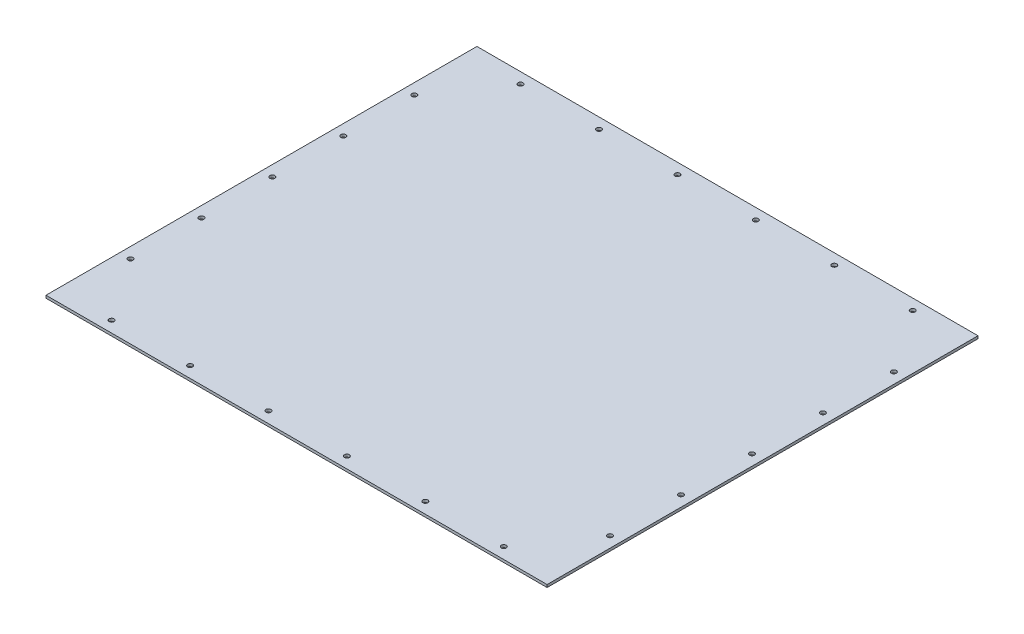
ISO-10303-21;
HEADER;
FILE_DESCRIPTION(('STEP AP214'),'2;1');
FILE_NAME('part.step','',(''),(''),'','','');
FILE_SCHEMA(('AUTOMOTIVE_DESIGN { 1 0 10303 214 1 1 1 1 }'));
ENDSEC;
DATA;
#1=APPLICATION_CONTEXT('core data for automotive mechanical design processes');
#2=APPLICATION_PROTOCOL_DEFINITION('international standard','automotive_design',2000,#1);
#3=PRODUCT_CONTEXT('',#1,'mechanical');
#4=PRODUCT('Part','Part','',(#3));
#5=PRODUCT_RELATED_PRODUCT_CATEGORY('part','',(#4));
#6=PRODUCT_DEFINITION_FORMATION('','',#4);
#7=PRODUCT_DEFINITION_CONTEXT('part definition',#1,'design');
#8=PRODUCT_DEFINITION('design','',#6,#7);
#9=PRODUCT_DEFINITION_SHAPE('','',#8);
#10=(LENGTH_UNIT() NAMED_UNIT(*) SI_UNIT(.MILLI.,.METRE.));
#11=(NAMED_UNIT(*) PLANE_ANGLE_UNIT() SI_UNIT($,.RADIAN.));
#12=(NAMED_UNIT(*) SI_UNIT($,.STERADIAN.) SOLID_ANGLE_UNIT());
#13=UNCERTAINTY_MEASURE_WITH_UNIT(LENGTH_MEASURE(1.E-05),#10,'distance_accuracy_value','');
#14=(GEOMETRIC_REPRESENTATION_CONTEXT(3) GLOBAL_UNCERTAINTY_ASSIGNED_CONTEXT((#13)) GLOBAL_UNIT_ASSIGNED_CONTEXT((#10,
#11,#12)) REPRESENTATION_CONTEXT('',''));
#15=CARTESIAN_POINT('',(0.,0.,0.));
#16=DIRECTION('',(0.,0.,1.));
#17=DIRECTION('',(1.,0.,0.));
#18=AXIS2_PLACEMENT_3D('',#15,#16,#17);
#19=CARTESIAN_POINT('',(-279.5016,0.,165.284899808));
#20=DIRECTION('',(0.,1.,0.));
#21=DIRECTION('',(0.,0.,1.));
#22=AXIS2_PLACEMENT_3D('',#19,#20,#21);
#23=CYLINDRICAL_SURFACE('',#22,2.8956);
#24=CARTESIAN_POINT('',(-279.5016,0.,165.284899808));
#25=DIRECTION('',(0.,1.,0.));
#26=DIRECTION('',(0.,0.,1.));
#27=AXIS2_PLACEMENT_3D('',#24,#25,#26);
#28=CIRCLE('',#27,2.8956);
#29=CARTESIAN_POINT('',(-279.5016,0.,168.180499808));
#30=VERTEX_POINT('',#29);
#31=EDGE_CURVE('E41',#30,#30,#28,.T.);
#32=ORIENTED_EDGE('',*,*,#31,.F.);
#33=EDGE_LOOP('',(#32));
#34=FACE_BOUND('',#33,.T.);
#35=CARTESIAN_POINT('',(-279.5016,3.0734,165.284899808));
#36=DIRECTION('',(0.,1.,0.));
#37=DIRECTION('',(0.,0.,1.));
#38=AXIS2_PLACEMENT_3D('',#35,#36,#37);
#39=CIRCLE('',#38,2.8956);
#40=CARTESIAN_POINT('',(-279.5016,3.0734,168.180499808));
#41=VERTEX_POINT('',#40);
#42=EDGE_CURVE('E11',#41,#41,#39,.T.);
#43=ORIENTED_EDGE('',*,*,#42,.T.);
#44=EDGE_LOOP('',(#43));
#45=FACE_BOUND('',#44,.T.);
#46=ADVANCED_FACE('F33',(#34,#45),#23,.F.);
#47=CARTESIAN_POINT('',(-279.5016,0.,82.545799856));
#48=DIRECTION('',(0.,1.,0.));
#49=DIRECTION('',(0.,0.,1.));
#50=AXIS2_PLACEMENT_3D('',#47,#48,#49);
#51=CYLINDRICAL_SURFACE('',#50,2.8956);
#52=CARTESIAN_POINT('',(-279.5016,0.,82.545799856));
#53=DIRECTION('',(0.,1.,0.));
#54=DIRECTION('',(0.,0.,1.));
#55=AXIS2_PLACEMENT_3D('',#52,#53,#54);
#56=CIRCLE('',#55,2.8956);
#57=CARTESIAN_POINT('',(-279.5016,0.,85.441399856));
#58=VERTEX_POINT('',#57);
#59=EDGE_CURVE('E183',#58,#58,#56,.T.);
#60=ORIENTED_EDGE('',*,*,#59,.F.);
#61=EDGE_LOOP('',(#60));
#62=FACE_BOUND('',#61,.T.);
#63=CARTESIAN_POINT('',(-279.5016,3.0734,82.545799856));
#64=DIRECTION('',(0.,1.,0.));
#65=DIRECTION('',(0.,0.,1.));
#66=AXIS2_PLACEMENT_3D('',#63,#64,#65);
#67=CIRCLE('',#66,2.8956);
#68=CARTESIAN_POINT('',(-279.5016,3.0734,85.441399856));
#69=VERTEX_POINT('',#68);
#70=EDGE_CURVE('E186',#69,#69,#67,.T.);
#71=ORIENTED_EDGE('',*,*,#70,.T.);
#72=EDGE_LOOP('',(#71));
#73=FACE_BOUND('',#72,.T.);
#74=ADVANCED_FACE('F195',(#62,#73),#51,.F.);
#75=CARTESIAN_POINT('',(-279.5016,0.,-0.193300095999993));
#76=DIRECTION('',(0.,1.,0.));
#77=DIRECTION('',(0.,0.,1.));
#78=AXIS2_PLACEMENT_3D('',#75,#76,#77);
#79=CYLINDRICAL_SURFACE('',#78,2.8956);
#80=CARTESIAN_POINT('',(-279.5016,0.,-0.193300095999993));
#81=DIRECTION('',(0.,1.,0.));
#82=DIRECTION('',(0.,0.,1.));
#83=AXIS2_PLACEMENT_3D('',#80,#81,#82);
#84=CIRCLE('',#83,2.8956);
#85=CARTESIAN_POINT('',(-279.5016,0.,2.702299904));
#86=VERTEX_POINT('',#85);
#87=EDGE_CURVE('E177',#86,#86,#84,.T.);
#88=ORIENTED_EDGE('',*,*,#87,.F.);
#89=EDGE_LOOP('',(#88));
#90=FACE_BOUND('',#89,.T.);
#91=CARTESIAN_POINT('',(-279.5016,3.0734,-0.193300095999993));
#92=DIRECTION('',(0.,1.,0.));
#93=DIRECTION('',(0.,0.,1.));
#94=AXIS2_PLACEMENT_3D('',#91,#92,#93);
#95=CIRCLE('',#94,2.8956);
#96=CARTESIAN_POINT('',(-279.5016,3.0734,2.702299904));
#97=VERTEX_POINT('',#96);
#98=EDGE_CURVE('E180',#97,#97,#95,.T.);
#99=ORIENTED_EDGE('',*,*,#98,.T.);
#100=EDGE_LOOP('',(#99));
#101=FACE_BOUND('',#100,.T.);
#102=ADVANCED_FACE('F266',(#90,#101),#79,.F.);
#103=CARTESIAN_POINT('',(279.5016,0.,165.284899808));
#104=DIRECTION('',(0.,1.,0.));
#105=DIRECTION('',(0.,0.,1.));
#106=AXIS2_PLACEMENT_3D('',#103,#104,#105);
#107=CYLINDRICAL_SURFACE('',#106,2.8956);
#108=CARTESIAN_POINT('',(279.5016,0.,165.284899808));
#109=DIRECTION('',(0.,1.,0.));
#110=DIRECTION('',(0.,0.,1.));
#111=AXIS2_PLACEMENT_3D('',#108,#109,#110);
#112=CIRCLE('',#111,2.8956);
#113=CARTESIAN_POINT('',(279.5016,0.,168.180499808));
#114=VERTEX_POINT('',#113);
#115=EDGE_CURVE('E171',#114,#114,#112,.T.);
#116=ORIENTED_EDGE('',*,*,#115,.F.);
#117=EDGE_LOOP('',(#116));
#118=FACE_BOUND('',#117,.T.);
#119=CARTESIAN_POINT('',(279.5016,3.0734,165.284899808));
#120=DIRECTION('',(0.,1.,0.));
#121=DIRECTION('',(0.,0.,1.));
#122=AXIS2_PLACEMENT_3D('',#119,#120,#121);
#123=CIRCLE('',#122,2.8956);
#124=CARTESIAN_POINT('',(279.5016,3.0734,168.180499808));
#125=VERTEX_POINT('',#124);
#126=EDGE_CURVE('E174',#125,#125,#123,.T.);
#127=ORIENTED_EDGE('',*,*,#126,.T.);
#128=EDGE_LOOP('',(#127));
#129=FACE_BOUND('',#128,.T.);
#130=ADVANCED_FACE('F262',(#118,#129),#107,.F.);
#131=CARTESIAN_POINT('',(279.5016,0.,82.545799856));
#132=DIRECTION('',(0.,1.,0.));
#133=DIRECTION('',(0.,0.,1.));
#134=AXIS2_PLACEMENT_3D('',#131,#132,#133);
#135=CYLINDRICAL_SURFACE('',#134,2.8956);
#136=CARTESIAN_POINT('',(279.5016,0.,82.545799856));
#137=DIRECTION('',(0.,1.,0.));
#138=DIRECTION('',(0.,0.,1.));
#139=AXIS2_PLACEMENT_3D('',#136,#137,#138);
#140=CIRCLE('',#139,2.8956);
#141=CARTESIAN_POINT('',(279.5016,0.,85.441399856));
#142=VERTEX_POINT('',#141);
#143=EDGE_CURVE('E165',#142,#142,#140,.T.);
#144=ORIENTED_EDGE('',*,*,#143,.F.);
#145=EDGE_LOOP('',(#144));
#146=FACE_BOUND('',#145,.T.);
#147=CARTESIAN_POINT('',(279.5016,3.0734,82.545799856));
#148=DIRECTION('',(0.,1.,0.));
#149=DIRECTION('',(0.,0.,1.));
#150=AXIS2_PLACEMENT_3D('',#147,#148,#149);
#151=CIRCLE('',#150,2.8956);
#152=CARTESIAN_POINT('',(279.5016,3.0734,85.441399856));
#153=VERTEX_POINT('',#152);
#154=EDGE_CURVE('E168',#153,#153,#151,.T.);
#155=ORIENTED_EDGE('',*,*,#154,.T.);
#156=EDGE_LOOP('',(#155));
#157=FACE_BOUND('',#156,.T.);
#158=ADVANCED_FACE('F258',(#146,#157),#135,.F.);
#159=CARTESIAN_POINT('',(279.5016,0.,-0.193300095999993));
#160=DIRECTION('',(0.,1.,0.));
#161=DIRECTION('',(0.,0.,1.));
#162=AXIS2_PLACEMENT_3D('',#159,#160,#161);
#163=CYLINDRICAL_SURFACE('',#162,2.8956);
#164=CARTESIAN_POINT('',(279.5016,0.,-0.193300095999993));
#165=DIRECTION('',(0.,1.,0.));
#166=DIRECTION('',(0.,0.,1.));
#167=AXIS2_PLACEMENT_3D('',#164,#165,#166);
#168=CIRCLE('',#167,2.8956);
#169=CARTESIAN_POINT('',(279.5016,0.,2.702299904));
#170=VERTEX_POINT('',#169);
#171=EDGE_CURVE('E159',#170,#170,#168,.T.);
#172=ORIENTED_EDGE('',*,*,#171,.F.);
#173=EDGE_LOOP('',(#172));
#174=FACE_BOUND('',#173,.T.);
#175=CARTESIAN_POINT('',(279.5016,3.0734,-0.193300095999993));
#176=DIRECTION('',(0.,1.,0.));
#177=DIRECTION('',(0.,0.,1.));
#178=AXIS2_PLACEMENT_3D('',#175,#176,#177);
#179=CIRCLE('',#178,2.8956);
#180=CARTESIAN_POINT('',(279.5016,3.0734,2.702299904));
#181=VERTEX_POINT('',#180);
#182=EDGE_CURVE('E162',#181,#181,#179,.T.);
#183=ORIENTED_EDGE('',*,*,#182,.T.);
#184=EDGE_LOOP('',(#183));
#185=FACE_BOUND('',#184,.T.);
#186=ADVANCED_FACE('F254',(#174,#185),#163,.F.);
#187=CARTESIAN_POINT('',(228.6,0.,-238.5949));
#188=DIRECTION('',(0.,1.,0.));
#189=DIRECTION('',(0.,0.,1.));
#190=AXIS2_PLACEMENT_3D('',#187,#188,#189);
#191=CYLINDRICAL_SURFACE('',#190,2.8956);
#192=CARTESIAN_POINT('',(228.6,0.,-238.5949));
#193=DIRECTION('',(0.,1.,0.));
#194=DIRECTION('',(0.,0.,1.));
#195=AXIS2_PLACEMENT_3D('',#192,#193,#194);
#196=CIRCLE('',#195,2.8956);
#197=CARTESIAN_POINT('',(228.6,0.,-235.6993));
#198=VERTEX_POINT('',#197);
#199=EDGE_CURVE('E153',#198,#198,#196,.T.);
#200=ORIENTED_EDGE('',*,*,#199,.F.);
#201=EDGE_LOOP('',(#200));
#202=FACE_BOUND('',#201,.T.);
#203=CARTESIAN_POINT('',(228.6,3.0734,-238.5949));
#204=DIRECTION('',(0.,1.,0.));
#205=DIRECTION('',(0.,0.,1.));
#206=AXIS2_PLACEMENT_3D('',#203,#204,#205);
#207=CIRCLE('',#206,2.8956);
#208=CARTESIAN_POINT('',(228.6,3.0734,-235.6993));
#209=VERTEX_POINT('',#208);
#210=EDGE_CURVE('E156',#209,#209,#207,.T.);
#211=ORIENTED_EDGE('',*,*,#210,.T.);
#212=EDGE_LOOP('',(#211));
#213=FACE_BOUND('',#212,.T.);
#214=ADVANCED_FACE('F250',(#202,#213),#191,.F.);
#215=CARTESIAN_POINT('',(137.16,0.,-238.5949));
#216=DIRECTION('',(0.,1.,0.));
#217=DIRECTION('',(0.,0.,1.));
#218=AXIS2_PLACEMENT_3D('',#215,#216,#217);
#219=CYLINDRICAL_SURFACE('',#218,2.8956);
#220=CARTESIAN_POINT('',(137.16,0.,-238.5949));
#221=DIRECTION('',(0.,1.,0.));
#222=DIRECTION('',(0.,0.,1.));
#223=AXIS2_PLACEMENT_3D('',#220,#221,#222);
#224=CIRCLE('',#223,2.8956);
#225=CARTESIAN_POINT('',(137.16,0.,-235.6993));
#226=VERTEX_POINT('',#225);
#227=EDGE_CURVE('E147',#226,#226,#224,.T.);
#228=ORIENTED_EDGE('',*,*,#227,.F.);
#229=EDGE_LOOP('',(#228));
#230=FACE_BOUND('',#229,.T.);
#231=CARTESIAN_POINT('',(137.16,3.0734,-238.5949));
#232=DIRECTION('',(0.,1.,0.));
#233=DIRECTION('',(0.,0.,1.));
#234=AXIS2_PLACEMENT_3D('',#231,#232,#233);
#235=CIRCLE('',#234,2.8956);
#236=CARTESIAN_POINT('',(137.16,3.0734,-235.6993));
#237=VERTEX_POINT('',#236);
#238=EDGE_CURVE('E150',#237,#237,#235,.T.);
#239=ORIENTED_EDGE('',*,*,#238,.T.);
#240=EDGE_LOOP('',(#239));
#241=FACE_BOUND('',#240,.T.);
#242=ADVANCED_FACE('F246',(#230,#241),#219,.F.);
#243=CARTESIAN_POINT('',(45.72,0.,-238.5949));
#244=DIRECTION('',(0.,1.,0.));
#245=DIRECTION('',(0.,0.,1.));
#246=AXIS2_PLACEMENT_3D('',#243,#244,#245);
#247=CYLINDRICAL_SURFACE('',#246,2.8956);
#248=CARTESIAN_POINT('',(45.72,0.,-238.5949));
#249=DIRECTION('',(0.,1.,0.));
#250=DIRECTION('',(0.,0.,1.));
#251=AXIS2_PLACEMENT_3D('',#248,#249,#250);
#252=CIRCLE('',#251,2.8956);
#253=CARTESIAN_POINT('',(45.72,0.,-235.6993));
#254=VERTEX_POINT('',#253);
#255=EDGE_CURVE('E141',#254,#254,#252,.T.);
#256=ORIENTED_EDGE('',*,*,#255,.F.);
#257=EDGE_LOOP('',(#256));
#258=FACE_BOUND('',#257,.T.);
#259=CARTESIAN_POINT('',(45.72,3.0734,-238.5949));
#260=DIRECTION('',(0.,1.,0.));
#261=DIRECTION('',(0.,0.,1.));
#262=AXIS2_PLACEMENT_3D('',#259,#260,#261);
#263=CIRCLE('',#262,2.8956);
#264=CARTESIAN_POINT('',(45.72,3.0734,-235.6993));
#265=VERTEX_POINT('',#264);
#266=EDGE_CURVE('E144',#265,#265,#263,.T.);
#267=ORIENTED_EDGE('',*,*,#266,.T.);
#268=EDGE_LOOP('',(#267));
#269=FACE_BOUND('',#268,.T.);
#270=ADVANCED_FACE('F242',(#258,#269),#247,.F.);
#271=CARTESIAN_POINT('',(-45.72,0.,-238.5949));
#272=DIRECTION('',(0.,1.,0.));
#273=DIRECTION('',(0.,0.,1.));
#274=AXIS2_PLACEMENT_3D('',#271,#272,#273);
#275=CYLINDRICAL_SURFACE('',#274,2.8956);
#276=CARTESIAN_POINT('',(-45.72,0.,-238.5949));
#277=DIRECTION('',(0.,1.,0.));
#278=DIRECTION('',(0.,0.,1.));
#279=AXIS2_PLACEMENT_3D('',#276,#277,#278);
#280=CIRCLE('',#279,2.8956);
#281=CARTESIAN_POINT('',(-45.72,0.,-235.6993));
#282=VERTEX_POINT('',#281);
#283=EDGE_CURVE('E135',#282,#282,#280,.T.);
#284=ORIENTED_EDGE('',*,*,#283,.F.);
#285=EDGE_LOOP('',(#284));
#286=FACE_BOUND('',#285,.T.);
#287=CARTESIAN_POINT('',(-45.72,3.0734,-238.5949));
#288=DIRECTION('',(0.,1.,0.));
#289=DIRECTION('',(0.,0.,1.));
#290=AXIS2_PLACEMENT_3D('',#287,#288,#289);
#291=CIRCLE('',#290,2.8956);
#292=CARTESIAN_POINT('',(-45.72,3.0734,-235.6993));
#293=VERTEX_POINT('',#292);
#294=EDGE_CURVE('E138',#293,#293,#291,.T.);
#295=ORIENTED_EDGE('',*,*,#294,.T.);
#296=EDGE_LOOP('',(#295));
#297=FACE_BOUND('',#296,.T.);
#298=ADVANCED_FACE('F238',(#286,#297),#275,.F.);
#299=CARTESIAN_POINT('',(228.6,0.,238.208299808));
#300=DIRECTION('',(0.,1.,0.));
#301=DIRECTION('',(0.,0.,1.));
#302=AXIS2_PLACEMENT_3D('',#299,#300,#301);
#303=CYLINDRICAL_SURFACE('',#302,2.8956);
#304=CARTESIAN_POINT('',(228.6,0.,238.208299808));
#305=DIRECTION('',(0.,1.,0.));
#306=DIRECTION('',(0.,0.,1.));
#307=AXIS2_PLACEMENT_3D('',#304,#305,#306);
#308=CIRCLE('',#307,2.8956);
#309=CARTESIAN_POINT('',(228.6,0.,241.103899808));
#310=VERTEX_POINT('',#309);
#311=EDGE_CURVE('E129',#310,#310,#308,.T.);
#312=ORIENTED_EDGE('',*,*,#311,.F.);
#313=EDGE_LOOP('',(#312));
#314=FACE_BOUND('',#313,.T.);
#315=CARTESIAN_POINT('',(228.6,3.0734,238.208299808));
#316=DIRECTION('',(0.,1.,0.));
#317=DIRECTION('',(0.,0.,1.));
#318=AXIS2_PLACEMENT_3D('',#315,#316,#317);
#319=CIRCLE('',#318,2.8956);
#320=CARTESIAN_POINT('',(228.6,3.0734,241.103899808));
#321=VERTEX_POINT('',#320);
#322=EDGE_CURVE('E132',#321,#321,#319,.T.);
#323=ORIENTED_EDGE('',*,*,#322,.T.);
#324=EDGE_LOOP('',(#323));
#325=FACE_BOUND('',#324,.T.);
#326=ADVANCED_FACE('F234',(#314,#325),#303,.F.);
#327=CARTESIAN_POINT('',(137.16,0.,238.208299808));
#328=DIRECTION('',(0.,1.,0.));
#329=DIRECTION('',(0.,0.,1.));
#330=AXIS2_PLACEMENT_3D('',#327,#328,#329);
#331=CYLINDRICAL_SURFACE('',#330,2.8956);
#332=CARTESIAN_POINT('',(137.16,0.,238.208299808));
#333=DIRECTION('',(0.,1.,0.));
#334=DIRECTION('',(0.,0.,1.));
#335=AXIS2_PLACEMENT_3D('',#332,#333,#334);
#336=CIRCLE('',#335,2.8956);
#337=CARTESIAN_POINT('',(137.16,0.,241.103899808));
#338=VERTEX_POINT('',#337);
#339=EDGE_CURVE('E123',#338,#338,#336,.T.);
#340=ORIENTED_EDGE('',*,*,#339,.F.);
#341=EDGE_LOOP('',(#340));
#342=FACE_BOUND('',#341,.T.);
#343=CARTESIAN_POINT('',(137.16,3.0734,238.208299808));
#344=DIRECTION('',(0.,1.,0.));
#345=DIRECTION('',(0.,0.,1.));
#346=AXIS2_PLACEMENT_3D('',#343,#344,#345);
#347=CIRCLE('',#346,2.8956);
#348=CARTESIAN_POINT('',(137.16,3.0734,241.103899808));
#349=VERTEX_POINT('',#348);
#350=EDGE_CURVE('E126',#349,#349,#347,.T.);
#351=ORIENTED_EDGE('',*,*,#350,.T.);
#352=EDGE_LOOP('',(#351));
#353=FACE_BOUND('',#352,.T.);
#354=ADVANCED_FACE('F230',(#342,#353),#331,.F.);
#355=CARTESIAN_POINT('',(45.72,0.,238.208299808));
#356=DIRECTION('',(0.,1.,0.));
#357=DIRECTION('',(0.,0.,1.));
#358=AXIS2_PLACEMENT_3D('',#355,#356,#357);
#359=CYLINDRICAL_SURFACE('',#358,2.8956);
#360=CARTESIAN_POINT('',(45.72,0.,238.208299808));
#361=DIRECTION('',(0.,1.,0.));
#362=DIRECTION('',(0.,0.,1.));
#363=AXIS2_PLACEMENT_3D('',#360,#361,#362);
#364=CIRCLE('',#363,2.8956);
#365=CARTESIAN_POINT('',(45.72,0.,241.103899808));
#366=VERTEX_POINT('',#365);
#367=EDGE_CURVE('E117',#366,#366,#364,.T.);
#368=ORIENTED_EDGE('',*,*,#367,.F.);
#369=EDGE_LOOP('',(#368));
#370=FACE_BOUND('',#369,.T.);
#371=CARTESIAN_POINT('',(45.72,3.0734,238.208299808));
#372=DIRECTION('',(0.,1.,0.));
#373=DIRECTION('',(0.,0.,1.));
#374=AXIS2_PLACEMENT_3D('',#371,#372,#373);
#375=CIRCLE('',#374,2.8956);
#376=CARTESIAN_POINT('',(45.72,3.0734,241.103899808));
#377=VERTEX_POINT('',#376);
#378=EDGE_CURVE('E120',#377,#377,#375,.T.);
#379=ORIENTED_EDGE('',*,*,#378,.T.);
#380=EDGE_LOOP('',(#379));
#381=FACE_BOUND('',#380,.T.);
#382=ADVANCED_FACE('F226',(#370,#381),#359,.F.);
#383=CARTESIAN_POINT('',(-45.72,0.,238.208299808));
#384=DIRECTION('',(0.,1.,0.));
#385=DIRECTION('',(0.,0.,1.));
#386=AXIS2_PLACEMENT_3D('',#383,#384,#385);
#387=CYLINDRICAL_SURFACE('',#386,2.8956);
#388=CARTESIAN_POINT('',(-45.72,0.,238.208299808));
#389=DIRECTION('',(0.,1.,0.));
#390=DIRECTION('',(0.,0.,1.));
#391=AXIS2_PLACEMENT_3D('',#388,#389,#390);
#392=CIRCLE('',#391,2.8956);
#393=CARTESIAN_POINT('',(-45.72,0.,241.103899808));
#394=VERTEX_POINT('',#393);
#395=EDGE_CURVE('E111',#394,#394,#392,.T.);
#396=ORIENTED_EDGE('',*,*,#395,.F.);
#397=EDGE_LOOP('',(#396));
#398=FACE_BOUND('',#397,.T.);
#399=CARTESIAN_POINT('',(-45.72,3.0734,238.208299808));
#400=DIRECTION('',(0.,1.,0.));
#401=DIRECTION('',(0.,0.,1.));
#402=AXIS2_PLACEMENT_3D('',#399,#400,#401);
#403=CIRCLE('',#402,2.8956);
#404=CARTESIAN_POINT('',(-45.72,3.0734,241.103899808));
#405=VERTEX_POINT('',#404);
#406=EDGE_CURVE('E114',#405,#405,#403,.T.);
#407=ORIENTED_EDGE('',*,*,#406,.T.);
#408=EDGE_LOOP('',(#407));
#409=FACE_BOUND('',#408,.T.);
#410=ADVANCED_FACE('F222',(#398,#409),#387,.F.);
#411=CARTESIAN_POINT('',(292.1,3.0734,-251.1933));
#412=DIRECTION('',(-1.,0.,0.));
#413=DIRECTION('',(0.,0.,1.));
#414=AXIS2_PLACEMENT_3D('',#411,#412,#413);
#415=PLANE('',#414);
#416=DIRECTION('',(0.,0.,-1.));
#417=VECTOR('',#416,1.);
#418=CARTESIAN_POINT('',(292.1,0.,-251.1933));
#419=LINE('',#418,#417);
#420=CARTESIAN_POINT('',(292.1,0.,251.1933));
#421=VERTEX_POINT('',#420);
#422=CARTESIAN_POINT('',(292.1,0.,-251.1933));
#423=VERTEX_POINT('',#422);
#424=EDGE_CURVE('E101',#421,#423,#419,.T.);
#425=ORIENTED_EDGE('',*,*,#424,.T.);
#426=DIRECTION('',(0.,-1.,0.));
#427=VECTOR('',#426,1.);
#428=CARTESIAN_POINT('',(292.1,3.0734,-251.1933));
#429=LINE('',#428,#427);
#430=CARTESIAN_POINT('',(292.1,3.0734,-251.1933));
#431=VERTEX_POINT('',#430);
#432=EDGE_CURVE('E92',#431,#423,#429,.T.);
#433=ORIENTED_EDGE('',*,*,#432,.F.);
#434=DIRECTION('',(0.,0.,-1.));
#435=VECTOR('',#434,1.);
#436=CARTESIAN_POINT('',(292.1,3.0734,-251.1933));
#437=LINE('',#436,#435);
#438=CARTESIAN_POINT('',(292.1,3.0734,251.1933));
#439=VERTEX_POINT('',#438);
#440=EDGE_CURVE('E86',#439,#431,#437,.T.);
#441=ORIENTED_EDGE('',*,*,#440,.F.);
#442=DIRECTION('',(0.,-1.,0.));
#443=VECTOR('',#442,1.);
#444=CARTESIAN_POINT('',(292.1,3.0734,251.1933));
#445=LINE('',#444,#443);
#446=EDGE_CURVE('E97',#439,#421,#445,.T.);
#447=ORIENTED_EDGE('',*,*,#446,.T.);
#448=EDGE_LOOP('',(#425,#433,#441,#447));
#449=FACE_BOUND('',#448,.T.);
#450=ADVANCED_FACE('F219',(#449),#415,.F.);
#451=CARTESIAN_POINT('',(-292.1,3.0734,-251.1933));
#452=DIRECTION('',(0.,0.,1.));
#453=DIRECTION('',(1.,0.,0.));
#454=AXIS2_PLACEMENT_3D('',#451,#452,#453);
#455=PLANE('',#454);
#456=DIRECTION('',(-1.,0.,0.));
#457=VECTOR('',#456,1.);
#458=CARTESIAN_POINT('',(-292.1,0.,-251.1933));
#459=LINE('',#458,#457);
#460=CARTESIAN_POINT('',(-292.1,0.,-251.1933));
#461=VERTEX_POINT('',#460);
#462=EDGE_CURVE('E91',#423,#461,#459,.T.);
#463=ORIENTED_EDGE('',*,*,#462,.T.);
#464=DIRECTION('',(0.,-1.,0.));
#465=VECTOR('',#464,1.);
#466=CARTESIAN_POINT('',(-292.1,3.0734,-251.1933));
#467=LINE('',#466,#465);
#468=CARTESIAN_POINT('',(-292.1,3.0734,-251.1933));
#469=VERTEX_POINT('',#468);
#470=EDGE_CURVE('E89',#469,#461,#467,.T.);
#471=ORIENTED_EDGE('',*,*,#470,.F.);
#472=DIRECTION('',(-1.,0.,0.));
#473=VECTOR('',#472,1.);
#474=CARTESIAN_POINT('',(-292.1,3.0734,-251.1933));
#475=LINE('',#474,#473);
#476=EDGE_CURVE('E80',#431,#469,#475,.T.);
#477=ORIENTED_EDGE('',*,*,#476,.F.);
#478=ORIENTED_EDGE('',*,*,#432,.T.);
#479=EDGE_LOOP('',(#463,#471,#477,#478));
#480=FACE_BOUND('',#479,.T.);
#481=ADVANCED_FACE('F90',(#480),#455,.F.);
#482=CARTESIAN_POINT('',(-292.1,3.0734,-251.1933));
#483=DIRECTION('',(1.,0.,0.));
#484=DIRECTION('',(0.,0.,-1.));
#485=AXIS2_PLACEMENT_3D('',#482,#483,#484);
#486=PLANE('',#485);
#487=DIRECTION('',(0.,0.,1.));
#488=VECTOR('',#487,1.);
#489=CARTESIAN_POINT('',(-292.1,0.,-251.1933));
#490=LINE('',#489,#488);
#491=CARTESIAN_POINT('',(-292.1,0.,251.1933));
#492=VERTEX_POINT('',#491);
#493=EDGE_CURVE('E66',#461,#492,#490,.T.);
#494=ORIENTED_EDGE('',*,*,#493,.T.);
#495=DIRECTION('',(0.,-1.,0.));
#496=VECTOR('',#495,1.);
#497=CARTESIAN_POINT('',(-292.1,3.0734,251.1933));
#498=LINE('',#497,#496);
#499=CARTESIAN_POINT('',(-292.1,3.0734,251.1933));
#500=VERTEX_POINT('',#499);
#501=EDGE_CURVE('E93',#500,#492,#498,.T.);
#502=ORIENTED_EDGE('',*,*,#501,.F.);
#503=DIRECTION('',(0.,0.,1.));
#504=VECTOR('',#503,1.);
#505=CARTESIAN_POINT('',(-292.1,3.0734,-251.1933));
#506=LINE('',#505,#504);
#507=EDGE_CURVE('E84',#469,#500,#506,.T.);
#508=ORIENTED_EDGE('',*,*,#507,.F.);
#509=ORIENTED_EDGE('',*,*,#470,.T.);
#510=EDGE_LOOP('',(#494,#502,#508,#509));
#511=FACE_BOUND('',#510,.T.);
#512=ADVANCED_FACE('F95',(#511),#486,.F.);
#513=CARTESIAN_POINT('',(-292.1,3.0734,251.1933));
#514=DIRECTION('',(0.,0.,-1.));
#515=DIRECTION('',(-1.,0.,0.));
#516=AXIS2_PLACEMENT_3D('',#513,#514,#515);
#517=PLANE('',#516);
#518=DIRECTION('',(1.,0.,0.));
#519=VECTOR('',#518,1.);
#520=CARTESIAN_POINT('',(-292.1,0.,251.1933));
#521=LINE('',#520,#519);
#522=EDGE_CURVE('E72',#492,#421,#521,.T.);
#523=ORIENTED_EDGE('',*,*,#522,.T.);
#524=ORIENTED_EDGE('',*,*,#446,.F.);
#525=DIRECTION('',(1.,0.,0.));
#526=VECTOR('',#525,1.);
#527=CARTESIAN_POINT('',(-292.1,3.0734,251.1933));
#528=LINE('',#527,#526);
#529=EDGE_CURVE('E49',#500,#439,#528,.T.);
#530=ORIENTED_EDGE('',*,*,#529,.F.);
#531=ORIENTED_EDGE('',*,*,#501,.T.);
#532=EDGE_LOOP('',(#523,#524,#530,#531));
#533=FACE_BOUND('',#532,.T.);
#534=ADVANCED_FACE('F199',(#533),#517,.F.);
#535=CARTESIAN_POINT('',(0.,3.0734,0.));
#536=DIRECTION('',(0.,1.,0.));
#537=DIRECTION('',(0.,0.,1.));
#538=AXIS2_PLACEMENT_3D('',#535,#536,#537);
#539=PLANE('',#538);
#540=CARTESIAN_POINT('',(-279.5016,3.0734,-82.932400048));
#541=DIRECTION('',(0.,1.,0.));
#542=DIRECTION('',(0.,0.,1.));
#543=AXIS2_PLACEMENT_3D('',#540,#541,#542);
#544=CIRCLE('',#543,2.8956);
#545=CARTESIAN_POINT('',(-279.5016,3.0734,-80.036800048));
#546=VERTEX_POINT('',#545);
#547=EDGE_CURVE('E464',#546,#546,#544,.T.);
#548=ORIENTED_EDGE('',*,*,#547,.F.);
#549=EDGE_LOOP('',(#548));
#550=FACE_BOUND('',#549,.T.);
#551=CARTESIAN_POINT('',(279.5016,3.0734,-82.932400048));
#552=DIRECTION('',(0.,1.,0.));
#553=DIRECTION('',(0.,0.,1.));
#554=AXIS2_PLACEMENT_3D('',#551,#552,#553);
#555=CIRCLE('',#554,2.8956);
#556=CARTESIAN_POINT('',(279.5016,3.0734,-80.036800048));
#557=VERTEX_POINT('',#556);
#558=EDGE_CURVE('E468',#557,#557,#555,.T.);
#559=ORIENTED_EDGE('',*,*,#558,.F.);
#560=EDGE_LOOP('',(#559));
#561=FACE_BOUND('',#560,.T.);
#562=CARTESIAN_POINT('',(279.5016,3.0734,-165.6715));
#563=DIRECTION('',(0.,1.,0.));
#564=DIRECTION('',(0.,0.,1.));
#565=AXIS2_PLACEMENT_3D('',#562,#563,#564);
#566=CIRCLE('',#565,2.8956);
#567=CARTESIAN_POINT('',(279.5016,3.0734,-162.7759));
#568=VERTEX_POINT('',#567);
#569=EDGE_CURVE('E474',#568,#568,#566,.T.);
#570=ORIENTED_EDGE('',*,*,#569,.F.);
#571=EDGE_LOOP('',(#570));
#572=FACE_BOUND('',#571,.T.);
#573=CARTESIAN_POINT('',(-279.5016,3.0734,-165.6715));
#574=DIRECTION('',(0.,1.,0.));
#575=DIRECTION('',(0.,0.,1.));
#576=AXIS2_PLACEMENT_3D('',#573,#574,#575);
#577=CIRCLE('',#576,2.8956);
#578=CARTESIAN_POINT('',(-279.5016,3.0734,-162.7759));
#579=VERTEX_POINT('',#578);
#580=EDGE_CURVE('E478',#579,#579,#577,.T.);
#581=ORIENTED_EDGE('',*,*,#580,.F.);
#582=EDGE_LOOP('',(#581));
#583=FACE_BOUND('',#582,.T.);
#584=CARTESIAN_POINT('',(-137.16,3.0734,-238.5949));
#585=DIRECTION('',(0.,1.,0.));
#586=DIRECTION('',(0.,0.,1.));
#587=AXIS2_PLACEMENT_3D('',#584,#585,#586);
#588=CIRCLE('',#587,2.8956);
#589=CARTESIAN_POINT('',(-137.16,3.0734,-235.6993));
#590=VERTEX_POINT('',#589);
#591=EDGE_CURVE('E489',#590,#590,#588,.T.);
#592=ORIENTED_EDGE('',*,*,#591,.F.);
#593=EDGE_LOOP('',(#592));
#594=FACE_BOUND('',#593,.T.);
#595=CARTESIAN_POINT('',(-137.16,3.0734,238.208299808));
#596=DIRECTION('',(0.,1.,0.));
#597=DIRECTION('',(0.,0.,1.));
#598=AXIS2_PLACEMENT_3D('',#595,#596,#597);
#599=CIRCLE('',#598,2.8956);
#600=CARTESIAN_POINT('',(-137.16,3.0734,241.103899808));
#601=VERTEX_POINT('',#600);
#602=EDGE_CURVE('E495',#601,#601,#599,.T.);
#603=ORIENTED_EDGE('',*,*,#602,.F.);
#604=EDGE_LOOP('',(#603));
#605=FACE_BOUND('',#604,.T.);
#606=CARTESIAN_POINT('',(-228.6,3.0734,238.208299808));
#607=DIRECTION('',(0.,1.,0.));
#608=DIRECTION('',(0.,0.,1.));
#609=AXIS2_PLACEMENT_3D('',#606,#607,#608);
#610=CIRCLE('',#609,2.8956);
#611=CARTESIAN_POINT('',(-228.6,3.0734,241.103899808));
#612=VERTEX_POINT('',#611);
#613=EDGE_CURVE('E498',#612,#612,#610,.T.);
#614=ORIENTED_EDGE('',*,*,#613,.F.);
#615=EDGE_LOOP('',(#614));
#616=FACE_BOUND('',#615,.T.);
#617=CARTESIAN_POINT('',(-228.6,3.0734,-238.5949));
#618=DIRECTION('',(0.,1.,0.));
#619=DIRECTION('',(0.,0.,1.));
#620=AXIS2_PLACEMENT_3D('',#617,#618,#619);
#621=CIRCLE('',#620,2.8956);
#622=CARTESIAN_POINT('',(-228.6,3.0734,-235.6993));
#623=VERTEX_POINT('',#622);
#624=EDGE_CURVE('E502',#623,#623,#621,.T.);
#625=ORIENTED_EDGE('',*,*,#624,.F.);
#626=EDGE_LOOP('',(#625));
#627=FACE_BOUND('',#626,.T.);
#628=ORIENTED_EDGE('',*,*,#440,.T.);
#629=ORIENTED_EDGE('',*,*,#476,.T.);
#630=ORIENTED_EDGE('',*,*,#507,.T.);
#631=ORIENTED_EDGE('',*,*,#529,.T.);
#632=EDGE_LOOP('',(#628,#629,#630,#631));
#633=FACE_BOUND('',#632,.T.);
#634=ORIENTED_EDGE('',*,*,#406,.F.);
#635=EDGE_LOOP('',(#634));
#636=FACE_BOUND('',#635,.T.);
#637=ORIENTED_EDGE('',*,*,#378,.F.);
#638=EDGE_LOOP('',(#637));
#639=FACE_BOUND('',#638,.T.);
#640=ORIENTED_EDGE('',*,*,#350,.F.);
#641=EDGE_LOOP('',(#640));
#642=FACE_BOUND('',#641,.T.);
#643=ORIENTED_EDGE('',*,*,#322,.F.);
#644=EDGE_LOOP('',(#643));
#645=FACE_BOUND('',#644,.T.);
#646=ORIENTED_EDGE('',*,*,#294,.F.);
#647=EDGE_LOOP('',(#646));
#648=FACE_BOUND('',#647,.T.);
#649=ORIENTED_EDGE('',*,*,#266,.F.);
#650=EDGE_LOOP('',(#649));
#651=FACE_BOUND('',#650,.T.);
#652=ORIENTED_EDGE('',*,*,#238,.F.);
#653=EDGE_LOOP('',(#652));
#654=FACE_BOUND('',#653,.T.);
#655=ORIENTED_EDGE('',*,*,#210,.F.);
#656=EDGE_LOOP('',(#655));
#657=FACE_BOUND('',#656,.T.);
#658=ORIENTED_EDGE('',*,*,#182,.F.);
#659=EDGE_LOOP('',(#658));
#660=FACE_BOUND('',#659,.T.);
#661=ORIENTED_EDGE('',*,*,#154,.F.);
#662=EDGE_LOOP('',(#661));
#663=FACE_BOUND('',#662,.T.);
#664=ORIENTED_EDGE('',*,*,#126,.F.);
#665=EDGE_LOOP('',(#664));
#666=FACE_BOUND('',#665,.T.);
#667=ORIENTED_EDGE('',*,*,#98,.F.);
#668=EDGE_LOOP('',(#667));
#669=FACE_BOUND('',#668,.T.);
#670=ORIENTED_EDGE('',*,*,#70,.F.);
#671=EDGE_LOOP('',(#670));
#672=FACE_BOUND('',#671,.T.);
#673=ORIENTED_EDGE('',*,*,#42,.F.);
#674=EDGE_LOOP('',(#673));
#675=FACE_BOUND('',#674,.T.);
#676=ADVANCED_FACE('F81',(#550,#561,#572,#583,#594,#605,#616,#627,#633,#636,#639,#642,#645,#648,
#651,#654,#657,#660,#663,#666,#669,#672,#675),#539,.T.);
#677=CARTESIAN_POINT('',(0.,0.,0.));
#678=DIRECTION('',(0.,1.,0.));
#679=DIRECTION('',(0.,0.,1.));
#680=AXIS2_PLACEMENT_3D('',#677,#678,#679);
#681=PLANE('',#680);
#682=CARTESIAN_POINT('',(-279.5016,0.,-82.932400048));
#683=DIRECTION('',(0.,1.,0.));
#684=DIRECTION('',(0.,0.,1.));
#685=AXIS2_PLACEMENT_3D('',#682,#683,#684);
#686=CIRCLE('',#685,2.8956);
#687=CARTESIAN_POINT('',(-279.5016,0.,-80.036800048));
#688=VERTEX_POINT('',#687);
#689=EDGE_CURVE('E462',#688,#688,#686,.T.);
#690=ORIENTED_EDGE('',*,*,#689,.T.);
#691=EDGE_LOOP('',(#690));
#692=FACE_BOUND('',#691,.T.);
#693=CARTESIAN_POINT('',(279.5016,0.,-82.932400048));
#694=DIRECTION('',(0.,1.,0.));
#695=DIRECTION('',(0.,0.,1.));
#696=AXIS2_PLACEMENT_3D('',#693,#694,#695);
#697=CIRCLE('',#696,2.8956);
#698=CARTESIAN_POINT('',(279.5016,0.,-80.036800048));
#699=VERTEX_POINT('',#698);
#700=EDGE_CURVE('E465',#699,#699,#697,.T.);
#701=ORIENTED_EDGE('',*,*,#700,.T.);
#702=EDGE_LOOP('',(#701));
#703=FACE_BOUND('',#702,.T.);
#704=CARTESIAN_POINT('',(279.5016,0.,-165.6715));
#705=DIRECTION('',(0.,1.,0.));
#706=DIRECTION('',(0.,0.,1.));
#707=AXIS2_PLACEMENT_3D('',#704,#705,#706);
#708=CIRCLE('',#707,2.8956);
#709=CARTESIAN_POINT('',(279.5016,0.,-162.7759));
#710=VERTEX_POINT('',#709);
#711=EDGE_CURVE('E475',#710,#710,#708,.T.);
#712=ORIENTED_EDGE('',*,*,#711,.T.);
#713=EDGE_LOOP('',(#712));
#714=FACE_BOUND('',#713,.T.);
#715=CARTESIAN_POINT('',(-279.5016,0.,-165.6715));
#716=DIRECTION('',(0.,1.,0.));
#717=DIRECTION('',(0.,0.,1.));
#718=AXIS2_PLACEMENT_3D('',#715,#716,#717);
#719=CIRCLE('',#718,2.8956);
#720=CARTESIAN_POINT('',(-279.5016,0.,-162.7759));
#721=VERTEX_POINT('',#720);
#722=EDGE_CURVE('E481',#721,#721,#719,.T.);
#723=ORIENTED_EDGE('',*,*,#722,.T.);
#724=EDGE_LOOP('',(#723));
#725=FACE_BOUND('',#724,.T.);
#726=CARTESIAN_POINT('',(-137.16,0.,-238.5949));
#727=DIRECTION('',(0.,1.,0.));
#728=DIRECTION('',(0.,0.,1.));
#729=AXIS2_PLACEMENT_3D('',#726,#727,#728);
#730=CIRCLE('',#729,2.8956);
#731=CARTESIAN_POINT('',(-137.16,0.,-235.6993));
#732=VERTEX_POINT('',#731);
#733=EDGE_CURVE('E484',#732,#732,#730,.T.);
#734=ORIENTED_EDGE('',*,*,#733,.T.);
#735=EDGE_LOOP('',(#734));
#736=FACE_BOUND('',#735,.T.);
#737=CARTESIAN_POINT('',(-137.16,0.,238.208299808));
#738=DIRECTION('',(0.,1.,0.));
#739=DIRECTION('',(0.,0.,1.));
#740=AXIS2_PLACEMENT_3D('',#737,#738,#739);
#741=CIRCLE('',#740,2.8956);
#742=CARTESIAN_POINT('',(-137.16,0.,241.103899808));
#743=VERTEX_POINT('',#742);
#744=EDGE_CURVE('E492',#743,#743,#741,.T.);
#745=ORIENTED_EDGE('',*,*,#744,.T.);
#746=EDGE_LOOP('',(#745));
#747=FACE_BOUND('',#746,.T.);
#748=CARTESIAN_POINT('',(-228.6,0.,238.208299808));
#749=DIRECTION('',(0.,1.,0.));
#750=DIRECTION('',(0.,0.,1.));
#751=AXIS2_PLACEMENT_3D('',#748,#749,#750);
#752=CIRCLE('',#751,2.8956);
#753=CARTESIAN_POINT('',(-228.6,0.,241.103899808));
#754=VERTEX_POINT('',#753);
#755=EDGE_CURVE('E499',#754,#754,#752,.T.);
#756=ORIENTED_EDGE('',*,*,#755,.T.);
#757=EDGE_LOOP('',(#756));
#758=FACE_BOUND('',#757,.T.);
#759=CARTESIAN_POINT('',(-228.6,0.,-238.5949));
#760=DIRECTION('',(0.,1.,0.));
#761=DIRECTION('',(0.,0.,1.));
#762=AXIS2_PLACEMENT_3D('',#759,#760,#761);
#763=CIRCLE('',#762,2.8956);
#764=CARTESIAN_POINT('',(-228.6,0.,-235.6993));
#765=VERTEX_POINT('',#764);
#766=EDGE_CURVE('E104',#765,#765,#763,.T.);
#767=ORIENTED_EDGE('',*,*,#766,.T.);
#768=EDGE_LOOP('',(#767));
#769=FACE_BOUND('',#768,.T.);
#770=ORIENTED_EDGE('',*,*,#424,.F.);
#771=ORIENTED_EDGE('',*,*,#522,.F.);
#772=ORIENTED_EDGE('',*,*,#493,.F.);
#773=ORIENTED_EDGE('',*,*,#462,.F.);
#774=EDGE_LOOP('',(#770,#771,#772,#773));
#775=FACE_BOUND('',#774,.T.);
#776=ORIENTED_EDGE('',*,*,#395,.T.);
#777=EDGE_LOOP('',(#776));
#778=FACE_BOUND('',#777,.T.);
#779=ORIENTED_EDGE('',*,*,#367,.T.);
#780=EDGE_LOOP('',(#779));
#781=FACE_BOUND('',#780,.T.);
#782=ORIENTED_EDGE('',*,*,#339,.T.);
#783=EDGE_LOOP('',(#782));
#784=FACE_BOUND('',#783,.T.);
#785=ORIENTED_EDGE('',*,*,#311,.T.);
#786=EDGE_LOOP('',(#785));
#787=FACE_BOUND('',#786,.T.);
#788=ORIENTED_EDGE('',*,*,#283,.T.);
#789=EDGE_LOOP('',(#788));
#790=FACE_BOUND('',#789,.T.);
#791=ORIENTED_EDGE('',*,*,#255,.T.);
#792=EDGE_LOOP('',(#791));
#793=FACE_BOUND('',#792,.T.);
#794=ORIENTED_EDGE('',*,*,#227,.T.);
#795=EDGE_LOOP('',(#794));
#796=FACE_BOUND('',#795,.T.);
#797=ORIENTED_EDGE('',*,*,#199,.T.);
#798=EDGE_LOOP('',(#797));
#799=FACE_BOUND('',#798,.T.);
#800=ORIENTED_EDGE('',*,*,#171,.T.);
#801=EDGE_LOOP('',(#800));
#802=FACE_BOUND('',#801,.T.);
#803=ORIENTED_EDGE('',*,*,#143,.T.);
#804=EDGE_LOOP('',(#803));
#805=FACE_BOUND('',#804,.T.);
#806=ORIENTED_EDGE('',*,*,#115,.T.);
#807=EDGE_LOOP('',(#806));
#808=FACE_BOUND('',#807,.T.);
#809=ORIENTED_EDGE('',*,*,#87,.T.);
#810=EDGE_LOOP('',(#809));
#811=FACE_BOUND('',#810,.T.);
#812=ORIENTED_EDGE('',*,*,#59,.T.);
#813=EDGE_LOOP('',(#812));
#814=FACE_BOUND('',#813,.T.);
#815=ORIENTED_EDGE('',*,*,#31,.T.);
#816=EDGE_LOOP('',(#815));
#817=FACE_BOUND('',#816,.T.);
#818=ADVANCED_FACE('F191',(#692,#703,#714,#725,#736,#747,#758,#769,#775,#778,#781,#784,#787,
#790,#793,#796,#799,#802,#805,#808,#811,#814,#817),#681,.F.);
#819=CARTESIAN_POINT('',(-228.6,0.,-238.5949));
#820=DIRECTION('',(0.,1.,0.));
#821=DIRECTION('',(0.,0.,1.));
#822=AXIS2_PLACEMENT_3D('',#819,#820,#821);
#823=CYLINDRICAL_SURFACE('',#822,2.8956);
#824=ORIENTED_EDGE('',*,*,#766,.F.);
#825=EDGE_LOOP('',(#824));
#826=FACE_BOUND('',#825,.T.);
#827=ORIENTED_EDGE('',*,*,#624,.T.);
#828=EDGE_LOOP('',(#827));
#829=FACE_BOUND('',#828,.T.);
#830=ADVANCED_FACE('F206',(#826,#829),#823,.F.);
#831=CARTESIAN_POINT('',(-228.6,0.,238.208299808));
#832=DIRECTION('',(0.,1.,0.));
#833=DIRECTION('',(0.,0.,1.));
#834=AXIS2_PLACEMENT_3D('',#831,#832,#833);
#835=CYLINDRICAL_SURFACE('',#834,2.8956);
#836=ORIENTED_EDGE('',*,*,#755,.F.);
#837=EDGE_LOOP('',(#836));
#838=FACE_BOUND('',#837,.T.);
#839=ORIENTED_EDGE('',*,*,#613,.T.);
#840=EDGE_LOOP('',(#839));
#841=FACE_BOUND('',#840,.T.);
#842=ADVANCED_FACE('F356',(#838,#841),#835,.F.);
#843=CARTESIAN_POINT('',(-137.16,0.,238.208299808));
#844=DIRECTION('',(0.,1.,0.));
#845=DIRECTION('',(0.,0.,1.));
#846=AXIS2_PLACEMENT_3D('',#843,#844,#845);
#847=CYLINDRICAL_SURFACE('',#846,2.8956);
#848=ORIENTED_EDGE('',*,*,#744,.F.);
#849=EDGE_LOOP('',(#848));
#850=FACE_BOUND('',#849,.T.);
#851=ORIENTED_EDGE('',*,*,#602,.T.);
#852=EDGE_LOOP('',(#851));
#853=FACE_BOUND('',#852,.T.);
#854=ADVANCED_FACE('F365',(#850,#853),#847,.F.);
#855=CARTESIAN_POINT('',(-137.16,0.,-238.5949));
#856=DIRECTION('',(0.,1.,0.));
#857=DIRECTION('',(0.,0.,1.));
#858=AXIS2_PLACEMENT_3D('',#855,#856,#857);
#859=CYLINDRICAL_SURFACE('',#858,2.8956);
#860=ORIENTED_EDGE('',*,*,#733,.F.);
#861=EDGE_LOOP('',(#860));
#862=FACE_BOUND('',#861,.T.);
#863=ORIENTED_EDGE('',*,*,#591,.T.);
#864=EDGE_LOOP('',(#863));
#865=FACE_BOUND('',#864,.T.);
#866=ADVANCED_FACE('F373',(#862,#865),#859,.F.);
#867=CARTESIAN_POINT('',(-279.5016,0.,-165.6715));
#868=DIRECTION('',(0.,1.,0.));
#869=DIRECTION('',(0.,0.,1.));
#870=AXIS2_PLACEMENT_3D('',#867,#868,#869);
#871=CYLINDRICAL_SURFACE('',#870,2.8956);
#872=ORIENTED_EDGE('',*,*,#722,.F.);
#873=EDGE_LOOP('',(#872));
#874=FACE_BOUND('',#873,.T.);
#875=ORIENTED_EDGE('',*,*,#580,.T.);
#876=EDGE_LOOP('',(#875));
#877=FACE_BOUND('',#876,.T.);
#878=ADVANCED_FACE('F381',(#874,#877),#871,.F.);
#879=CARTESIAN_POINT('',(279.5016,0.,-165.6715));
#880=DIRECTION('',(0.,1.,0.));
#881=DIRECTION('',(0.,0.,1.));
#882=AXIS2_PLACEMENT_3D('',#879,#880,#881);
#883=CYLINDRICAL_SURFACE('',#882,2.8956);
#884=ORIENTED_EDGE('',*,*,#711,.F.);
#885=EDGE_LOOP('',(#884));
#886=FACE_BOUND('',#885,.T.);
#887=ORIENTED_EDGE('',*,*,#569,.T.);
#888=EDGE_LOOP('',(#887));
#889=FACE_BOUND('',#888,.T.);
#890=ADVANCED_FACE('F389',(#886,#889),#883,.F.);
#891=CARTESIAN_POINT('',(279.5016,0.,-82.932400048));
#892=DIRECTION('',(0.,1.,0.));
#893=DIRECTION('',(0.,0.,1.));
#894=AXIS2_PLACEMENT_3D('',#891,#892,#893);
#895=CYLINDRICAL_SURFACE('',#894,2.8956);
#896=ORIENTED_EDGE('',*,*,#700,.F.);
#897=EDGE_LOOP('',(#896));
#898=FACE_BOUND('',#897,.T.);
#899=ORIENTED_EDGE('',*,*,#558,.T.);
#900=EDGE_LOOP('',(#899));
#901=FACE_BOUND('',#900,.T.);
#902=ADVANCED_FACE('F397',(#898,#901),#895,.F.);
#903=CARTESIAN_POINT('',(-279.5016,0.,-82.932400048));
#904=DIRECTION('',(0.,1.,0.));
#905=DIRECTION('',(0.,0.,1.));
#906=AXIS2_PLACEMENT_3D('',#903,#904,#905);
#907=CYLINDRICAL_SURFACE('',#906,2.8956);
#908=ORIENTED_EDGE('',*,*,#689,.F.);
#909=EDGE_LOOP('',(#908));
#910=FACE_BOUND('',#909,.T.);
#911=ORIENTED_EDGE('',*,*,#547,.T.);
#912=EDGE_LOOP('',(#911));
#913=FACE_BOUND('',#912,.T.);
#914=ADVANCED_FACE('F405',(#910,#913),#907,.F.);
#915=CLOSED_SHELL('',(#46,#74,#102,#130,#158,#186,#214,#242,#270,#298,#326,#354,#382,#410,#450,
#481,#512,#534,#676,#818,#830,#842,#854,#866,#878,#890,#902,#914));
#916=MANIFOLD_SOLID_BREP('B2',#915);
#917=ADVANCED_BREP_SHAPE_REPRESENTATION('',(#18,#916),#14);
#918=SHAPE_DEFINITION_REPRESENTATION(#9,#917);
ENDSEC;
END-ISO-10303-21;
